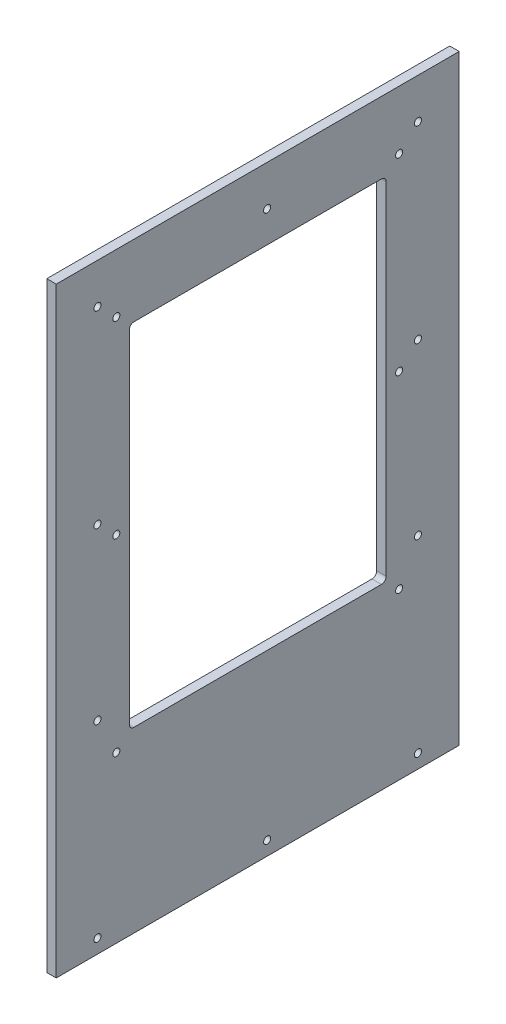
ISO-10303-21;
HEADER;
FILE_DESCRIPTION(('STEP AP214'),'2;1');
FILE_NAME('part.step','',(''),(''),'','','');
FILE_SCHEMA(('AUTOMOTIVE_DESIGN { 1 0 10303 214 1 1 1 1 }'));
ENDSEC;
DATA;
#1=APPLICATION_CONTEXT('core data for automotive mechanical design processes');
#2=APPLICATION_PROTOCOL_DEFINITION('international standard','automotive_design',2000,#1);
#3=PRODUCT_CONTEXT('',#1,'mechanical');
#4=PRODUCT('Part','Part','',(#3));
#5=PRODUCT_RELATED_PRODUCT_CATEGORY('part','',(#4));
#6=PRODUCT_DEFINITION_FORMATION('','',#4);
#7=PRODUCT_DEFINITION_CONTEXT('part definition',#1,'design');
#8=PRODUCT_DEFINITION('design','',#6,#7);
#9=PRODUCT_DEFINITION_SHAPE('','',#8);
#10=(LENGTH_UNIT() NAMED_UNIT(*) SI_UNIT(.MILLI.,.METRE.));
#11=(NAMED_UNIT(*) PLANE_ANGLE_UNIT() SI_UNIT($,.RADIAN.));
#12=(NAMED_UNIT(*) SI_UNIT($,.STERADIAN.) SOLID_ANGLE_UNIT());
#13=UNCERTAINTY_MEASURE_WITH_UNIT(LENGTH_MEASURE(1.E-05),#10,'distance_accuracy_value','');
#14=(GEOMETRIC_REPRESENTATION_CONTEXT(3) GLOBAL_UNCERTAINTY_ASSIGNED_CONTEXT((#13)) GLOBAL_UNIT_ASSIGNED_CONTEXT((#10,
#11,#12)) REPRESENTATION_CONTEXT('',''));
#15=CARTESIAN_POINT('',(0.,0.,0.));
#16=DIRECTION('',(0.,0.,1.));
#17=DIRECTION('',(1.,0.,0.));
#18=AXIS2_PLACEMENT_3D('',#15,#16,#17);
#19=CARTESIAN_POINT('',(12.7,-404.8125,-271.4625));
#20=DIRECTION('',(0.,0.,1.));
#21=DIRECTION('',(1.,0.,0.));
#22=AXIS2_PLACEMENT_3D('',#19,#20,#21);
#23=PLANE('',#22);
#24=DIRECTION('',(0.,1.,0.));
#25=VECTOR('',#24,1.);
#26=CARTESIAN_POINT('',(0.,-404.8125,-271.4625));
#27=LINE('',#26,#25);
#28=CARTESIAN_POINT('',(0.,-404.8125,-271.4625));
#29=VERTEX_POINT('',#28);
#30=CARTESIAN_POINT('',(0.,404.8125,-271.4625));
#31=VERTEX_POINT('',#30);
#32=EDGE_CURVE('E147',#29,#31,#27,.T.);
#33=ORIENTED_EDGE('',*,*,#32,.T.);
#34=DIRECTION('',(-1.,0.,0.));
#35=VECTOR('',#34,1.);
#36=CARTESIAN_POINT('',(12.7,404.8125,-271.4625));
#37=LINE('',#36,#35);
#38=CARTESIAN_POINT('',(12.7,404.8125,-271.4625));
#39=VERTEX_POINT('',#38);
#40=EDGE_CURVE('E128',#39,#31,#37,.T.);
#41=ORIENTED_EDGE('',*,*,#40,.F.);
#42=DIRECTION('',(0.,1.,0.));
#43=VECTOR('',#42,1.);
#44=CARTESIAN_POINT('',(12.7,-404.8125,-271.4625));
#45=LINE('',#44,#43);
#46=CARTESIAN_POINT('',(12.7,-404.8125,-271.4625));
#47=VERTEX_POINT('',#46);
#48=EDGE_CURVE('E135',#47,#39,#45,.T.);
#49=ORIENTED_EDGE('',*,*,#48,.F.);
#50=DIRECTION('',(-1.,0.,0.));
#51=VECTOR('',#50,1.);
#52=CARTESIAN_POINT('',(12.7,-404.8125,-271.4625));
#53=LINE('',#52,#51);
#54=EDGE_CURVE('E326',#47,#29,#53,.T.);
#55=ORIENTED_EDGE('',*,*,#54,.T.);
#56=EDGE_LOOP('',(#33,#41,#49,#55));
#57=FACE_BOUND('',#56,.T.);
#58=ADVANCED_FACE('F35',(#57),#23,.F.);
#59=CARTESIAN_POINT('',(12.7,404.8125,271.4625));
#60=DIRECTION('',(0.,-1.,0.));
#61=DIRECTION('',(0.,0.,-1.));
#62=AXIS2_PLACEMENT_3D('',#59,#60,#61);
#63=PLANE('',#62);
#64=DIRECTION('',(0.,0.,1.));
#65=VECTOR('',#64,1.);
#66=CARTESIAN_POINT('',(0.,404.8125,271.4625));
#67=LINE('',#66,#65);
#68=CARTESIAN_POINT('',(0.,404.8125,271.4625));
#69=VERTEX_POINT('',#68);
#70=EDGE_CURVE('E328',#31,#69,#67,.T.);
#71=ORIENTED_EDGE('',*,*,#70,.T.);
#72=DIRECTION('',(-1.,0.,0.));
#73=VECTOR('',#72,1.);
#74=CARTESIAN_POINT('',(12.7,404.8125,271.4625));
#75=LINE('',#74,#73);
#76=CARTESIAN_POINT('',(12.7,404.8125,271.4625));
#77=VERTEX_POINT('',#76);
#78=EDGE_CURVE('E131',#77,#69,#75,.T.);
#79=ORIENTED_EDGE('',*,*,#78,.F.);
#80=DIRECTION('',(0.,0.,1.));
#81=VECTOR('',#80,1.);
#82=CARTESIAN_POINT('',(12.7,404.8125,271.4625));
#83=LINE('',#82,#81);
#84=EDGE_CURVE('E124',#39,#77,#83,.T.);
#85=ORIENTED_EDGE('',*,*,#84,.F.);
#86=ORIENTED_EDGE('',*,*,#40,.T.);
#87=EDGE_LOOP('',(#71,#79,#85,#86));
#88=FACE_BOUND('',#87,.T.);
#89=ADVANCED_FACE('F126',(#88),#63,.F.);
#90=CARTESIAN_POINT('',(12.7,-404.8125,271.4625));
#91=DIRECTION('',(0.,0.,-1.));
#92=DIRECTION('',(-1.,0.,0.));
#93=AXIS2_PLACEMENT_3D('',#90,#91,#92);
#94=PLANE('',#93);
#95=DIRECTION('',(0.,-1.,0.));
#96=VECTOR('',#95,1.);
#97=CARTESIAN_POINT('',(0.,-404.8125,271.4625));
#98=LINE('',#97,#96);
#99=CARTESIAN_POINT('',(0.,-404.8125,271.4625));
#100=VERTEX_POINT('',#99);
#101=EDGE_CURVE('E330',#69,#100,#98,.T.);
#102=ORIENTED_EDGE('',*,*,#101,.T.);
#103=DIRECTION('',(-1.,0.,0.));
#104=VECTOR('',#103,1.);
#105=CARTESIAN_POINT('',(12.7,-404.8125,271.4625));
#106=LINE('',#105,#104);
#107=CARTESIAN_POINT('',(12.7,-404.8125,271.4625));
#108=VERTEX_POINT('',#107);
#109=EDGE_CURVE('E152',#108,#100,#106,.T.);
#110=ORIENTED_EDGE('',*,*,#109,.F.);
#111=DIRECTION('',(0.,-1.,0.));
#112=VECTOR('',#111,1.);
#113=CARTESIAN_POINT('',(12.7,-404.8125,271.4625));
#114=LINE('',#113,#112);
#115=EDGE_CURVE('E134',#77,#108,#114,.T.);
#116=ORIENTED_EDGE('',*,*,#115,.F.);
#117=ORIENTED_EDGE('',*,*,#78,.T.);
#118=EDGE_LOOP('',(#102,#110,#116,#117));
#119=FACE_BOUND('',#118,.T.);
#120=ADVANCED_FACE('F342',(#119),#94,.F.);
#121=CARTESIAN_POINT('',(12.7,-404.8125,271.4625));
#122=DIRECTION('',(0.,1.,0.));
#123=DIRECTION('',(0.,0.,1.));
#124=AXIS2_PLACEMENT_3D('',#121,#122,#123);
#125=PLANE('',#124);
#126=DIRECTION('',(0.,0.,-1.));
#127=VECTOR('',#126,1.);
#128=CARTESIAN_POINT('',(0.,-404.8125,271.4625));
#129=LINE('',#128,#127);
#130=EDGE_CURVE('E144',#100,#29,#129,.T.);
#131=ORIENTED_EDGE('',*,*,#130,.T.);
#132=ORIENTED_EDGE('',*,*,#54,.F.);
#133=DIRECTION('',(0.,0.,-1.));
#134=VECTOR('',#133,1.);
#135=CARTESIAN_POINT('',(12.7,-404.8125,271.4625));
#136=LINE('',#135,#134);
#137=EDGE_CURVE('E140',#108,#47,#136,.T.);
#138=ORIENTED_EDGE('',*,*,#137,.F.);
#139=ORIENTED_EDGE('',*,*,#109,.T.);
#140=EDGE_LOOP('',(#131,#132,#138,#139));
#141=FACE_BOUND('',#140,.T.);
#142=ADVANCED_FACE('F337',(#141),#125,.F.);
#143=CARTESIAN_POINT('',(12.7,0.,0.));
#144=DIRECTION('',(-1.,0.,0.));
#145=DIRECTION('',(0.,0.,1.));
#146=AXIS2_PLACEMENT_3D('',#143,#144,#145);
#147=PLANE('',#146);
#148=DIRECTION('',(0.,1.,0.));
#149=VECTOR('',#148,1.);
#150=CARTESIAN_POINT('',(12.7,308.45125,-173.0375));
#151=LINE('',#150,#149);
#152=CARTESIAN_POINT('',(12.7,-158.27375,-173.0375));
#153=VERTEX_POINT('',#152);
#154=CARTESIAN_POINT('',(12.7,302.10125,-173.0375));
#155=VERTEX_POINT('',#154);
#156=EDGE_CURVE('E190',#153,#155,#151,.T.);
#157=ORIENTED_EDGE('',*,*,#156,.F.);
#158=CARTESIAN_POINT('',(12.7,-158.27375,-166.6875));
#159=DIRECTION('',(-1.,0.,0.));
#160=DIRECTION('',(0.,0.,1.));
#161=AXIS2_PLACEMENT_3D('',#158,#159,#160);
#162=CIRCLE('',#161,6.35);
#163=CARTESIAN_POINT('',(12.7,-164.62375,-166.6875));
#164=VERTEX_POINT('',#163);
#165=EDGE_CURVE('E376',#153,#164,#162,.T.);
#166=ORIENTED_EDGE('',*,*,#165,.T.);
#167=DIRECTION('',(0.,0.,-1.));
#168=VECTOR('',#167,1.);
#169=CARTESIAN_POINT('',(12.7,-164.62375,173.0375));
#170=LINE('',#169,#168);
#171=CARTESIAN_POINT('',(12.7,-164.62375,166.6875));
#172=VERTEX_POINT('',#171);
#173=EDGE_CURVE('E386',#172,#164,#170,.T.);
#174=ORIENTED_EDGE('',*,*,#173,.F.);
#175=CARTESIAN_POINT('',(12.7,-158.27375,166.6875));
#176=DIRECTION('',(-1.,0.,0.));
#177=DIRECTION('',(0.,0.,1.));
#178=AXIS2_PLACEMENT_3D('',#175,#176,#177);
#179=CIRCLE('',#178,6.35);
#180=CARTESIAN_POINT('',(12.7,-158.27375,173.0375));
#181=VERTEX_POINT('',#180);
#182=EDGE_CURVE('E43',#172,#181,#179,.T.);
#183=ORIENTED_EDGE('',*,*,#182,.T.);
#184=DIRECTION('',(0.,-1.,0.));
#185=VECTOR('',#184,1.);
#186=CARTESIAN_POINT('',(12.7,308.45125,173.0375));
#187=LINE('',#186,#185);
#188=CARTESIAN_POINT('',(12.7,302.10125,173.0375));
#189=VERTEX_POINT('',#188);
#190=EDGE_CURVE('E189',#189,#181,#187,.T.);
#191=ORIENTED_EDGE('',*,*,#190,.F.);
#192=CARTESIAN_POINT('',(12.7,302.10125,166.6875));
#193=DIRECTION('',(-1.,0.,0.));
#194=DIRECTION('',(0.,0.,1.));
#195=AXIS2_PLACEMENT_3D('',#192,#193,#194);
#196=CIRCLE('',#195,6.35);
#197=CARTESIAN_POINT('',(12.7,308.45125,166.6875));
#198=VERTEX_POINT('',#197);
#199=EDGE_CURVE('E172',#189,#198,#196,.T.);
#200=ORIENTED_EDGE('',*,*,#199,.T.);
#201=DIRECTION('',(0.,0.,1.));
#202=VECTOR('',#201,1.);
#203=CARTESIAN_POINT('',(12.7,308.45125,173.0375));
#204=LINE('',#203,#202);
#205=CARTESIAN_POINT('',(12.7,308.45125,-166.6875));
#206=VERTEX_POINT('',#205);
#207=EDGE_CURVE('E185',#206,#198,#204,.T.);
#208=ORIENTED_EDGE('',*,*,#207,.F.);
#209=CARTESIAN_POINT('',(12.7,302.10125,-166.6875));
#210=DIRECTION('',(-1.,0.,0.));
#211=DIRECTION('',(0.,0.,1.));
#212=AXIS2_PLACEMENT_3D('',#209,#210,#211);
#213=CIRCLE('',#212,6.35);
#214=EDGE_CURVE('E418',#206,#155,#213,.T.);
#215=ORIENTED_EDGE('',*,*,#214,.T.);
#216=EDGE_LOOP('',(#157,#166,#174,#183,#191,#200,#208,#215));
#217=FACE_BOUND('',#216,.T.);
#218=CARTESIAN_POINT('',(12.7,71.9137500000002,190.5));
#219=DIRECTION('',(-1.,0.,0.));
#220=DIRECTION('',(0.,0.,1.));
#221=AXIS2_PLACEMENT_3D('',#218,#219,#220);
#222=CIRCLE('',#221,4.76250000000001);
#223=CARTESIAN_POINT('',(12.7,71.9137500000002,195.2625));
#224=VERTEX_POINT('',#223);
#225=EDGE_CURVE('E197',#224,#224,#222,.T.);
#226=ORIENTED_EDGE('',*,*,#225,.T.);
#227=EDGE_LOOP('',(#226));
#228=FACE_BOUND('',#227,.T.);
#229=CARTESIAN_POINT('',(12.7,71.9137500000002,-190.5));
#230=DIRECTION('',(-1.,0.,0.));
#231=DIRECTION('',(0.,0.,1.));
#232=AXIS2_PLACEMENT_3D('',#229,#230,#231);
#233=CIRCLE('',#232,4.76250000000001);
#234=CARTESIAN_POINT('',(12.7,71.9137500000002,-185.7375));
#235=VERTEX_POINT('',#234);
#236=EDGE_CURVE('E208',#235,#235,#233,.T.);
#237=ORIENTED_EDGE('',*,*,#236,.T.);
#238=EDGE_LOOP('',(#237));
#239=FACE_BOUND('',#238,.T.);
#240=CARTESIAN_POINT('',(12.7,-182.08625,190.5));
#241=DIRECTION('',(-1.,0.,0.));
#242=DIRECTION('',(0.,0.,1.));
#243=AXIS2_PLACEMENT_3D('',#240,#241,#242);
#244=CIRCLE('',#243,4.76250000000001);
#245=CARTESIAN_POINT('',(12.7,-182.08625,195.2625));
#246=VERTEX_POINT('',#245);
#247=EDGE_CURVE('E214',#246,#246,#244,.T.);
#248=ORIENTED_EDGE('',*,*,#247,.T.);
#249=EDGE_LOOP('',(#248));
#250=FACE_BOUND('',#249,.T.);
#251=CARTESIAN_POINT('',(12.7,-182.08625,-190.5));
#252=DIRECTION('',(-1.,0.,0.));
#253=DIRECTION('',(0.,0.,1.));
#254=AXIS2_PLACEMENT_3D('',#251,#252,#253);
#255=CIRCLE('',#254,4.76250000000001);
#256=CARTESIAN_POINT('',(12.7,-182.08625,-185.7375));
#257=VERTEX_POINT('',#256);
#258=EDGE_CURVE('E221',#257,#257,#255,.T.);
#259=ORIENTED_EDGE('',*,*,#258,.T.);
#260=EDGE_LOOP('',(#259));
#261=FACE_BOUND('',#260,.T.);
#262=CARTESIAN_POINT('',(12.7,325.91375,190.5));
#263=DIRECTION('',(-1.,0.,0.));
#264=DIRECTION('',(0.,0.,1.));
#265=AXIS2_PLACEMENT_3D('',#262,#263,#264);
#266=CIRCLE('',#265,4.76250000000001);
#267=CARTESIAN_POINT('',(12.7,325.91375,195.2625));
#268=VERTEX_POINT('',#267);
#269=EDGE_CURVE('E231',#268,#268,#266,.T.);
#270=ORIENTED_EDGE('',*,*,#269,.T.);
#271=EDGE_LOOP('',(#270));
#272=FACE_BOUND('',#271,.T.);
#273=CARTESIAN_POINT('',(12.7,325.91375,-190.5));
#274=DIRECTION('',(-1.,0.,0.));
#275=DIRECTION('',(0.,0.,1.));
#276=AXIS2_PLACEMENT_3D('',#273,#274,#275);
#277=CIRCLE('',#276,4.76250000000001);
#278=CARTESIAN_POINT('',(12.7,325.91375,-185.7375));
#279=VERTEX_POINT('',#278);
#280=EDGE_CURVE('E237',#279,#279,#277,.T.);
#281=ORIENTED_EDGE('',*,*,#280,.T.);
#282=EDGE_LOOP('',(#281));
#283=FACE_BOUND('',#282,.T.);
#284=CARTESIAN_POINT('',(12.7,96.5200000000002,-215.9));
#285=DIRECTION('',(1.,0.,0.));
#286=DIRECTION('',(0.,0.,1.));
#287=AXIS2_PLACEMENT_3D('',#284,#285,#286);
#288=CIRCLE('',#287,4.76250000000001);
#289=CARTESIAN_POINT('',(12.7,96.5200000000002,-211.1375));
#290=VERTEX_POINT('',#289);
#291=EDGE_CURVE('E241',#290,#290,#288,.T.);
#292=ORIENTED_EDGE('',*,*,#291,.F.);
#293=EDGE_LOOP('',(#292));
#294=FACE_BOUND('',#293,.T.);
#295=CARTESIAN_POINT('',(12.7,-132.08,-215.9));
#296=DIRECTION('',(1.,0.,0.));
#297=DIRECTION('',(0.,0.,1.));
#298=AXIS2_PLACEMENT_3D('',#295,#296,#297);
#299=CIRCLE('',#298,4.76250000000001);
#300=CARTESIAN_POINT('',(12.7,-132.08,-211.1375));
#301=VERTEX_POINT('',#300);
#302=EDGE_CURVE('E247',#301,#301,#299,.T.);
#303=ORIENTED_EDGE('',*,*,#302,.F.);
#304=EDGE_LOOP('',(#303));
#305=FACE_BOUND('',#304,.T.);
#306=CARTESIAN_POINT('',(12.7,-386.08,-12.6999999999999));
#307=DIRECTION('',(1.,0.,0.));
#308=DIRECTION('',(0.,0.,-1.));
#309=AXIS2_PLACEMENT_3D('',#306,#307,#308);
#310=CIRCLE('',#309,4.7625);
#311=CARTESIAN_POINT('',(12.7,-386.08,-17.4624999999999));
#312=VERTEX_POINT('',#311);
#313=EDGE_CURVE('E263',#312,#312,#310,.T.);
#314=ORIENTED_EDGE('',*,*,#313,.F.);
#315=EDGE_LOOP('',(#314));
#316=FACE_BOUND('',#315,.T.);
#317=CARTESIAN_POINT('',(12.7,350.52,-12.6999999999998));
#318=DIRECTION('',(1.,0.,0.));
#319=DIRECTION('',(0.,0.,-1.));
#320=AXIS2_PLACEMENT_3D('',#317,#318,#319);
#321=CIRCLE('',#320,4.7625);
#322=CARTESIAN_POINT('',(12.7,350.52,-17.4624999999998));
#323=VERTEX_POINT('',#322);
#324=EDGE_CURVE('E262',#323,#323,#321,.T.);
#325=ORIENTED_EDGE('',*,*,#324,.F.);
#326=EDGE_LOOP('',(#325));
#327=FACE_BOUND('',#326,.T.);
#328=CARTESIAN_POINT('',(12.7,-132.08,215.9));
#329=DIRECTION('',(1.,0.,0.));
#330=DIRECTION('',(0.,0.,-1.));
#331=AXIS2_PLACEMENT_3D('',#328,#329,#330);
#332=CIRCLE('',#331,4.76250000000001);
#333=CARTESIAN_POINT('',(12.7,-132.08,211.1375));
#334=VERTEX_POINT('',#333);
#335=EDGE_CURVE('E270',#334,#334,#332,.T.);
#336=ORIENTED_EDGE('',*,*,#335,.F.);
#337=EDGE_LOOP('',(#336));
#338=FACE_BOUND('',#337,.T.);
#339=CARTESIAN_POINT('',(12.7,96.5200000000002,215.9));
#340=DIRECTION('',(1.,0.,0.));
#341=DIRECTION('',(0.,0.,-1.));
#342=AXIS2_PLACEMENT_3D('',#339,#340,#341);
#343=CIRCLE('',#342,4.76250000000001);
#344=CARTESIAN_POINT('',(12.7,96.5200000000002,211.1375));
#345=VERTEX_POINT('',#344);
#346=EDGE_CURVE('E286',#345,#345,#343,.T.);
#347=ORIENTED_EDGE('',*,*,#346,.F.);
#348=EDGE_LOOP('',(#347));
#349=FACE_BOUND('',#348,.T.);
#350=CARTESIAN_POINT('',(12.7,-386.08,-215.9));
#351=DIRECTION('',(1.,0.,0.));
#352=DIRECTION('',(0.,0.,-1.));
#353=AXIS2_PLACEMENT_3D('',#350,#351,#352);
#354=CIRCLE('',#353,4.76250000000001);
#355=CARTESIAN_POINT('',(12.7,-386.08,-220.6625));
#356=VERTEX_POINT('',#355);
#357=EDGE_CURVE('E285',#356,#356,#354,.T.);
#358=ORIENTED_EDGE('',*,*,#357,.F.);
#359=EDGE_LOOP('',(#358));
#360=FACE_BOUND('',#359,.T.);
#361=CARTESIAN_POINT('',(12.7,-386.08,215.9));
#362=DIRECTION('',(1.,0.,0.));
#363=DIRECTION('',(0.,0.,-1.));
#364=AXIS2_PLACEMENT_3D('',#361,#362,#363);
#365=CIRCLE('',#364,4.76250000000001);
#366=CARTESIAN_POINT('',(12.7,-386.08,211.1375));
#367=VERTEX_POINT('',#366);
#368=EDGE_CURVE('E293',#367,#367,#365,.T.);
#369=ORIENTED_EDGE('',*,*,#368,.F.);
#370=EDGE_LOOP('',(#369));
#371=FACE_BOUND('',#370,.T.);
#372=CARTESIAN_POINT('',(12.7,350.52,-215.9));
#373=DIRECTION('',(1.,0.,0.));
#374=DIRECTION('',(0.,0.,-1.));
#375=AXIS2_PLACEMENT_3D('',#372,#373,#374);
#376=CIRCLE('',#375,4.76250000000004);
#377=CARTESIAN_POINT('',(12.7,350.52,-220.6625));
#378=VERTEX_POINT('',#377);
#379=EDGE_CURVE('E309',#378,#378,#376,.T.);
#380=ORIENTED_EDGE('',*,*,#379,.F.);
#381=EDGE_LOOP('',(#380));
#382=FACE_BOUND('',#381,.T.);
#383=CARTESIAN_POINT('',(12.7,350.52,215.9));
#384=DIRECTION('',(1.,0.,0.));
#385=DIRECTION('',(0.,0.,-1.));
#386=AXIS2_PLACEMENT_3D('',#383,#384,#385);
#387=CIRCLE('',#386,4.76250000000004);
#388=CARTESIAN_POINT('',(12.7,350.52,211.1375));
#389=VERTEX_POINT('',#388);
#390=EDGE_CURVE('E308',#389,#389,#387,.T.);
#391=ORIENTED_EDGE('',*,*,#390,.F.);
#392=EDGE_LOOP('',(#391));
#393=FACE_BOUND('',#392,.T.);
#394=ORIENTED_EDGE('',*,*,#48,.T.);
#395=ORIENTED_EDGE('',*,*,#84,.T.);
#396=ORIENTED_EDGE('',*,*,#115,.T.);
#397=ORIENTED_EDGE('',*,*,#137,.T.);
#398=EDGE_LOOP('',(#394,#395,#396,#397));
#399=FACE_BOUND('',#398,.T.);
#400=ADVANCED_FACE('F138',(#217,#228,#239,#250,#261,#272,#283,#294,#305,#316,#327,#338,#349,
#360,#371,#382,#393,#399),#147,.F.);
#401=CARTESIAN_POINT('',(0.,0.,0.));
#402=DIRECTION('',(-1.,0.,0.));
#403=DIRECTION('',(0.,0.,1.));
#404=AXIS2_PLACEMENT_3D('',#401,#402,#403);
#405=PLANE('',#404);
#406=DIRECTION('',(0.,-1.,0.));
#407=VECTOR('',#406,1.);
#408=CARTESIAN_POINT('',(0.,308.45125,173.0375));
#409=LINE('',#408,#407);
#410=CARTESIAN_POINT('',(0.,302.10125,173.0375));
#411=VERTEX_POINT('',#410);
#412=CARTESIAN_POINT('',(0.,-158.27375,173.0375));
#413=VERTEX_POINT('',#412);
#414=EDGE_CURVE('E389',#411,#413,#409,.T.);
#415=ORIENTED_EDGE('',*,*,#414,.T.);
#416=CARTESIAN_POINT('',(0.,-158.27375,166.6875));
#417=DIRECTION('',(-1.,0.,0.));
#418=DIRECTION('',(0.,0.,1.));
#419=AXIS2_PLACEMENT_3D('',#416,#417,#418);
#420=CIRCLE('',#419,6.35);
#421=CARTESIAN_POINT('',(0.,-164.62375,166.6875));
#422=VERTEX_POINT('',#421);
#423=EDGE_CURVE('E12',#413,#422,#420,.F.);
#424=ORIENTED_EDGE('',*,*,#423,.T.);
#425=DIRECTION('',(0.,0.,-1.));
#426=VECTOR('',#425,1.);
#427=CARTESIAN_POINT('',(0.,-164.62375,173.0375));
#428=LINE('',#427,#426);
#429=CARTESIAN_POINT('',(0.,-164.62375,-166.6875));
#430=VERTEX_POINT('',#429);
#431=EDGE_CURVE('E196',#422,#430,#428,.T.);
#432=ORIENTED_EDGE('',*,*,#431,.T.);
#433=CARTESIAN_POINT('',(0.,-158.27375,-166.6875));
#434=DIRECTION('',(-1.,0.,0.));
#435=DIRECTION('',(0.,0.,1.));
#436=AXIS2_PLACEMENT_3D('',#433,#434,#435);
#437=CIRCLE('',#436,6.35);
#438=CARTESIAN_POINT('',(0.,-158.27375,-173.0375));
#439=VERTEX_POINT('',#438);
#440=EDGE_CURVE('E373',#430,#439,#437,.F.);
#441=ORIENTED_EDGE('',*,*,#440,.T.);
#442=DIRECTION('',(0.,1.,0.));
#443=VECTOR('',#442,1.);
#444=CARTESIAN_POINT('',(0.,308.45125,-173.0375));
#445=LINE('',#444,#443);
#446=CARTESIAN_POINT('',(0.,302.10125,-173.0375));
#447=VERTEX_POINT('',#446);
#448=EDGE_CURVE('E394',#439,#447,#445,.T.);
#449=ORIENTED_EDGE('',*,*,#448,.T.);
#450=CARTESIAN_POINT('',(0.,302.10125,-166.6875));
#451=DIRECTION('',(-1.,0.,0.));
#452=DIRECTION('',(0.,0.,1.));
#453=AXIS2_PLACEMENT_3D('',#450,#451,#452);
#454=CIRCLE('',#453,6.35);
#455=CARTESIAN_POINT('',(0.,308.45125,-166.6875));
#456=VERTEX_POINT('',#455);
#457=EDGE_CURVE('E378',#447,#456,#454,.F.);
#458=ORIENTED_EDGE('',*,*,#457,.T.);
#459=DIRECTION('',(0.,0.,1.));
#460=VECTOR('',#459,1.);
#461=CARTESIAN_POINT('',(0.,308.45125,173.0375));
#462=LINE('',#461,#460);
#463=CARTESIAN_POINT('',(0.,308.45125,166.6875));
#464=VERTEX_POINT('',#463);
#465=EDGE_CURVE('E391',#456,#464,#462,.T.);
#466=ORIENTED_EDGE('',*,*,#465,.T.);
#467=CARTESIAN_POINT('',(0.,302.10125,166.6875));
#468=DIRECTION('',(-1.,0.,0.));
#469=DIRECTION('',(0.,0.,1.));
#470=AXIS2_PLACEMENT_3D('',#467,#468,#469);
#471=CIRCLE('',#470,6.35);
#472=EDGE_CURVE('E175',#464,#411,#471,.F.);
#473=ORIENTED_EDGE('',*,*,#472,.T.);
#474=EDGE_LOOP('',(#415,#424,#432,#441,#449,#458,#466,#473));
#475=FACE_BOUND('',#474,.T.);
#476=CARTESIAN_POINT('',(0.,71.9137500000002,190.5));
#477=DIRECTION('',(-1.,0.,0.));
#478=DIRECTION('',(0.,0.,1.));
#479=AXIS2_PLACEMENT_3D('',#476,#477,#478);
#480=CIRCLE('',#479,4.76250000000001);
#481=CARTESIAN_POINT('',(0.,71.9137500000002,195.2625));
#482=VERTEX_POINT('',#481);
#483=EDGE_CURVE('E202',#482,#482,#480,.T.);
#484=ORIENTED_EDGE('',*,*,#483,.F.);
#485=EDGE_LOOP('',(#484));
#486=FACE_BOUND('',#485,.T.);
#487=CARTESIAN_POINT('',(0.,71.9137500000002,-190.5));
#488=DIRECTION('',(-1.,0.,0.));
#489=DIRECTION('',(0.,0.,1.));
#490=AXIS2_PLACEMENT_3D('',#487,#488,#489);
#491=CIRCLE('',#490,4.76250000000001);
#492=CARTESIAN_POINT('',(0.,71.9137500000002,-185.7375));
#493=VERTEX_POINT('',#492);
#494=EDGE_CURVE('E201',#493,#493,#491,.T.);
#495=ORIENTED_EDGE('',*,*,#494,.F.);
#496=EDGE_LOOP('',(#495));
#497=FACE_BOUND('',#496,.T.);
#498=CARTESIAN_POINT('',(0.,-182.08625,190.5));
#499=DIRECTION('',(-1.,0.,0.));
#500=DIRECTION('',(0.,0.,1.));
#501=AXIS2_PLACEMENT_3D('',#498,#499,#500);
#502=CIRCLE('',#501,4.76250000000001);
#503=CARTESIAN_POINT('',(0.,-182.08625,195.2625));
#504=VERTEX_POINT('',#503);
#505=EDGE_CURVE('E212',#504,#504,#502,.T.);
#506=ORIENTED_EDGE('',*,*,#505,.F.);
#507=EDGE_LOOP('',(#506));
#508=FACE_BOUND('',#507,.T.);
#509=CARTESIAN_POINT('',(0.,-182.08625,-190.5));
#510=DIRECTION('',(-1.,0.,0.));
#511=DIRECTION('',(0.,0.,1.));
#512=AXIS2_PLACEMENT_3D('',#509,#510,#511);
#513=CIRCLE('',#512,4.76250000000001);
#514=CARTESIAN_POINT('',(0.,-182.08625,-185.7375));
#515=VERTEX_POINT('',#514);
#516=EDGE_CURVE('E218',#515,#515,#513,.T.);
#517=ORIENTED_EDGE('',*,*,#516,.F.);
#518=EDGE_LOOP('',(#517));
#519=FACE_BOUND('',#518,.T.);
#520=CARTESIAN_POINT('',(0.,325.91375,190.5));
#521=DIRECTION('',(-1.,0.,0.));
#522=DIRECTION('',(0.,0.,1.));
#523=AXIS2_PLACEMENT_3D('',#520,#521,#522);
#524=CIRCLE('',#523,4.76250000000001);
#525=CARTESIAN_POINT('',(0.,325.91375,195.2625));
#526=VERTEX_POINT('',#525);
#527=EDGE_CURVE('E225',#526,#526,#524,.T.);
#528=ORIENTED_EDGE('',*,*,#527,.F.);
#529=EDGE_LOOP('',(#528));
#530=FACE_BOUND('',#529,.T.);
#531=CARTESIAN_POINT('',(0.,325.91375,-190.5));
#532=DIRECTION('',(-1.,0.,0.));
#533=DIRECTION('',(0.,0.,1.));
#534=AXIS2_PLACEMENT_3D('',#531,#532,#533);
#535=CIRCLE('',#534,4.76250000000001);
#536=CARTESIAN_POINT('',(0.,325.91375,-185.7375));
#537=VERTEX_POINT('',#536);
#538=EDGE_CURVE('E235',#537,#537,#535,.T.);
#539=ORIENTED_EDGE('',*,*,#538,.F.);
#540=EDGE_LOOP('',(#539));
#541=FACE_BOUND('',#540,.T.);
#542=CARTESIAN_POINT('',(0.,96.5200000000002,-215.9));
#543=DIRECTION('',(1.,0.,0.));
#544=DIRECTION('',(0.,0.,1.));
#545=AXIS2_PLACEMENT_3D('',#542,#543,#544);
#546=CIRCLE('',#545,4.76250000000001);
#547=CARTESIAN_POINT('',(0.,96.5200000000002,-211.1375));
#548=VERTEX_POINT('',#547);
#549=EDGE_CURVE('E244',#548,#548,#546,.T.);
#550=ORIENTED_EDGE('',*,*,#549,.T.);
#551=EDGE_LOOP('',(#550));
#552=FACE_BOUND('',#551,.T.);
#553=CARTESIAN_POINT('',(0.,-132.08,-215.9));
#554=DIRECTION('',(1.,0.,0.));
#555=DIRECTION('',(0.,0.,1.));
#556=AXIS2_PLACEMENT_3D('',#553,#554,#555);
#557=CIRCLE('',#556,4.76250000000001);
#558=CARTESIAN_POINT('',(0.,-132.08,-211.1375));
#559=VERTEX_POINT('',#558);
#560=EDGE_CURVE('E251',#559,#559,#557,.T.);
#561=ORIENTED_EDGE('',*,*,#560,.T.);
#562=EDGE_LOOP('',(#561));
#563=FACE_BOUND('',#562,.T.);
#564=CARTESIAN_POINT('',(0.,-386.08,-12.6999999999999));
#565=DIRECTION('',(1.,0.,0.));
#566=DIRECTION('',(0.,0.,-1.));
#567=AXIS2_PLACEMENT_3D('',#564,#565,#566);
#568=CIRCLE('',#567,4.7625);
#569=CARTESIAN_POINT('',(0.,-386.08,-17.4624999999999));
#570=VERTEX_POINT('',#569);
#571=EDGE_CURVE('E260',#570,#570,#568,.T.);
#572=ORIENTED_EDGE('',*,*,#571,.T.);
#573=EDGE_LOOP('',(#572));
#574=FACE_BOUND('',#573,.T.);
#575=CARTESIAN_POINT('',(0.,350.52,-12.6999999999998));
#576=DIRECTION('',(1.,0.,0.));
#577=DIRECTION('',(0.,0.,-1.));
#578=AXIS2_PLACEMENT_3D('',#575,#576,#577);
#579=CIRCLE('',#578,4.7625);
#580=CARTESIAN_POINT('',(0.,350.52,-17.4624999999998));
#581=VERTEX_POINT('',#580);
#582=EDGE_CURVE('E267',#581,#581,#579,.T.);
#583=ORIENTED_EDGE('',*,*,#582,.T.);
#584=EDGE_LOOP('',(#583));
#585=FACE_BOUND('',#584,.T.);
#586=CARTESIAN_POINT('',(0.,-132.08,215.9));
#587=DIRECTION('',(1.,0.,0.));
#588=DIRECTION('',(0.,0.,-1.));
#589=AXIS2_PLACEMENT_3D('',#586,#587,#588);
#590=CIRCLE('',#589,4.76250000000001);
#591=CARTESIAN_POINT('',(0.,-132.08,211.1375));
#592=VERTEX_POINT('',#591);
#593=EDGE_CURVE('E274',#592,#592,#590,.T.);
#594=ORIENTED_EDGE('',*,*,#593,.T.);
#595=EDGE_LOOP('',(#594));
#596=FACE_BOUND('',#595,.T.);
#597=CARTESIAN_POINT('',(0.,96.5200000000002,215.9));
#598=DIRECTION('',(1.,0.,0.));
#599=DIRECTION('',(0.,0.,-1.));
#600=AXIS2_PLACEMENT_3D('',#597,#598,#599);
#601=CIRCLE('',#600,4.76250000000001);
#602=CARTESIAN_POINT('',(0.,96.5200000000002,211.1375));
#603=VERTEX_POINT('',#602);
#604=EDGE_CURVE('E283',#603,#603,#601,.T.);
#605=ORIENTED_EDGE('',*,*,#604,.T.);
#606=EDGE_LOOP('',(#605));
#607=FACE_BOUND('',#606,.T.);
#608=CARTESIAN_POINT('',(0.,-386.08,-215.9));
#609=DIRECTION('',(1.,0.,0.));
#610=DIRECTION('',(0.,0.,-1.));
#611=AXIS2_PLACEMENT_3D('',#608,#609,#610);
#612=CIRCLE('',#611,4.76250000000001);
#613=CARTESIAN_POINT('',(0.,-386.08,-220.6625));
#614=VERTEX_POINT('',#613);
#615=EDGE_CURVE('E290',#614,#614,#612,.T.);
#616=ORIENTED_EDGE('',*,*,#615,.T.);
#617=EDGE_LOOP('',(#616));
#618=FACE_BOUND('',#617,.T.);
#619=CARTESIAN_POINT('',(0.,-386.08,215.9));
#620=DIRECTION('',(1.,0.,0.));
#621=DIRECTION('',(0.,0.,-1.));
#622=AXIS2_PLACEMENT_3D('',#619,#620,#621);
#623=CIRCLE('',#622,4.76250000000001);
#624=CARTESIAN_POINT('',(0.,-386.08,211.1375));
#625=VERTEX_POINT('',#624);
#626=EDGE_CURVE('E297',#625,#625,#623,.T.);
#627=ORIENTED_EDGE('',*,*,#626,.T.);
#628=EDGE_LOOP('',(#627));
#629=FACE_BOUND('',#628,.T.);
#630=CARTESIAN_POINT('',(0.,350.52,-215.9));
#631=DIRECTION('',(1.,0.,0.));
#632=DIRECTION('',(0.,0.,-1.));
#633=AXIS2_PLACEMENT_3D('',#630,#631,#632);
#634=CIRCLE('',#633,4.76250000000004);
#635=CARTESIAN_POINT('',(0.,350.52,-220.6625));
#636=VERTEX_POINT('',#635);
#637=EDGE_CURVE('E306',#636,#636,#634,.T.);
#638=ORIENTED_EDGE('',*,*,#637,.T.);
#639=EDGE_LOOP('',(#638));
#640=FACE_BOUND('',#639,.T.);
#641=CARTESIAN_POINT('',(0.,350.52,215.9));
#642=DIRECTION('',(1.,0.,0.));
#643=DIRECTION('',(0.,0.,-1.));
#644=AXIS2_PLACEMENT_3D('',#641,#642,#643);
#645=CIRCLE('',#644,4.76250000000004);
#646=CARTESIAN_POINT('',(0.,350.52,211.1375));
#647=VERTEX_POINT('',#646);
#648=EDGE_CURVE('E313',#647,#647,#645,.T.);
#649=ORIENTED_EDGE('',*,*,#648,.T.);
#650=EDGE_LOOP('',(#649));
#651=FACE_BOUND('',#650,.T.);
#652=ORIENTED_EDGE('',*,*,#32,.F.);
#653=ORIENTED_EDGE('',*,*,#130,.F.);
#654=ORIENTED_EDGE('',*,*,#101,.F.);
#655=ORIENTED_EDGE('',*,*,#70,.F.);
#656=EDGE_LOOP('',(#652,#653,#654,#655));
#657=FACE_BOUND('',#656,.T.);
#658=ADVANCED_FACE('F341',(#475,#486,#497,#508,#519,#530,#541,#552,#563,#574,#585,#596,#607,
#618,#629,#640,#651,#657),#405,.T.);
#659=CARTESIAN_POINT('',(0.,350.52,215.9));
#660=DIRECTION('',(1.,0.,0.));
#661=DIRECTION('',(0.,0.,-1.));
#662=AXIS2_PLACEMENT_3D('',#659,#660,#661);
#663=CYLINDRICAL_SURFACE('',#662,4.76250000000004);
#664=ORIENTED_EDGE('',*,*,#648,.F.);
#665=EDGE_LOOP('',(#664));
#666=FACE_BOUND('',#665,.T.);
#667=ORIENTED_EDGE('',*,*,#390,.T.);
#668=EDGE_LOOP('',(#667));
#669=FACE_BOUND('',#668,.T.);
#670=ADVANCED_FACE('F491',(#666,#669),#663,.F.);
#671=CARTESIAN_POINT('',(0.,350.52,-215.9));
#672=DIRECTION('',(1.,0.,0.));
#673=DIRECTION('',(0.,0.,-1.));
#674=AXIS2_PLACEMENT_3D('',#671,#672,#673);
#675=CYLINDRICAL_SURFACE('',#674,4.76250000000004);
#676=ORIENTED_EDGE('',*,*,#637,.F.);
#677=EDGE_LOOP('',(#676));
#678=FACE_BOUND('',#677,.T.);
#679=ORIENTED_EDGE('',*,*,#379,.T.);
#680=EDGE_LOOP('',(#679));
#681=FACE_BOUND('',#680,.T.);
#682=ADVANCED_FACE('F487',(#678,#681),#675,.F.);
#683=CARTESIAN_POINT('',(0.,-386.08,215.9));
#684=DIRECTION('',(1.,0.,0.));
#685=DIRECTION('',(0.,0.,-1.));
#686=AXIS2_PLACEMENT_3D('',#683,#684,#685);
#687=CYLINDRICAL_SURFACE('',#686,4.76250000000001);
#688=ORIENTED_EDGE('',*,*,#626,.F.);
#689=EDGE_LOOP('',(#688));
#690=FACE_BOUND('',#689,.T.);
#691=ORIENTED_EDGE('',*,*,#368,.T.);
#692=EDGE_LOOP('',(#691));
#693=FACE_BOUND('',#692,.T.);
#694=ADVANCED_FACE('F483',(#690,#693),#687,.F.);
#695=CARTESIAN_POINT('',(0.,-386.08,-215.9));
#696=DIRECTION('',(1.,0.,0.));
#697=DIRECTION('',(0.,0.,-1.));
#698=AXIS2_PLACEMENT_3D('',#695,#696,#697);
#699=CYLINDRICAL_SURFACE('',#698,4.76250000000001);
#700=ORIENTED_EDGE('',*,*,#615,.F.);
#701=EDGE_LOOP('',(#700));
#702=FACE_BOUND('',#701,.T.);
#703=ORIENTED_EDGE('',*,*,#357,.T.);
#704=EDGE_LOOP('',(#703));
#705=FACE_BOUND('',#704,.T.);
#706=ADVANCED_FACE('F479',(#702,#705),#699,.F.);
#707=CARTESIAN_POINT('',(0.,96.5200000000002,215.9));
#708=DIRECTION('',(1.,0.,0.));
#709=DIRECTION('',(0.,0.,-1.));
#710=AXIS2_PLACEMENT_3D('',#707,#708,#709);
#711=CYLINDRICAL_SURFACE('',#710,4.76250000000001);
#712=ORIENTED_EDGE('',*,*,#604,.F.);
#713=EDGE_LOOP('',(#712));
#714=FACE_BOUND('',#713,.T.);
#715=ORIENTED_EDGE('',*,*,#346,.T.);
#716=EDGE_LOOP('',(#715));
#717=FACE_BOUND('',#716,.T.);
#718=ADVANCED_FACE('F475',(#714,#717),#711,.F.);
#719=CARTESIAN_POINT('',(0.,-132.08,215.9));
#720=DIRECTION('',(1.,0.,0.));
#721=DIRECTION('',(0.,0.,-1.));
#722=AXIS2_PLACEMENT_3D('',#719,#720,#721);
#723=CYLINDRICAL_SURFACE('',#722,4.76250000000001);
#724=ORIENTED_EDGE('',*,*,#593,.F.);
#725=EDGE_LOOP('',(#724));
#726=FACE_BOUND('',#725,.T.);
#727=ORIENTED_EDGE('',*,*,#335,.T.);
#728=EDGE_LOOP('',(#727));
#729=FACE_BOUND('',#728,.T.);
#730=ADVANCED_FACE('F471',(#726,#729),#723,.F.);
#731=CARTESIAN_POINT('',(0.,350.52,-12.6999999999998));
#732=DIRECTION('',(1.,0.,0.));
#733=DIRECTION('',(0.,0.,-1.));
#734=AXIS2_PLACEMENT_3D('',#731,#732,#733);
#735=CYLINDRICAL_SURFACE('',#734,4.7625);
#736=ORIENTED_EDGE('',*,*,#582,.F.);
#737=EDGE_LOOP('',(#736));
#738=FACE_BOUND('',#737,.T.);
#739=ORIENTED_EDGE('',*,*,#324,.T.);
#740=EDGE_LOOP('',(#739));
#741=FACE_BOUND('',#740,.T.);
#742=ADVANCED_FACE('F467',(#738,#741),#735,.F.);
#743=CARTESIAN_POINT('',(0.,-386.08,-12.6999999999999));
#744=DIRECTION('',(1.,0.,0.));
#745=DIRECTION('',(0.,0.,-1.));
#746=AXIS2_PLACEMENT_3D('',#743,#744,#745);
#747=CYLINDRICAL_SURFACE('',#746,4.7625);
#748=ORIENTED_EDGE('',*,*,#571,.F.);
#749=EDGE_LOOP('',(#748));
#750=FACE_BOUND('',#749,.T.);
#751=ORIENTED_EDGE('',*,*,#313,.T.);
#752=EDGE_LOOP('',(#751));
#753=FACE_BOUND('',#752,.T.);
#754=ADVANCED_FACE('F463',(#750,#753),#747,.F.);
#755=CARTESIAN_POINT('',(0.,-132.08,-215.9));
#756=DIRECTION('',(1.,0.,0.));
#757=DIRECTION('',(0.,0.,-1.));
#758=AXIS2_PLACEMENT_3D('',#755,#756,#757);
#759=CYLINDRICAL_SURFACE('',#758,4.76250000000001);
#760=ORIENTED_EDGE('',*,*,#560,.F.);
#761=EDGE_LOOP('',(#760));
#762=FACE_BOUND('',#761,.T.);
#763=ORIENTED_EDGE('',*,*,#302,.T.);
#764=EDGE_LOOP('',(#763));
#765=FACE_BOUND('',#764,.T.);
#766=ADVANCED_FACE('F459',(#762,#765),#759,.F.);
#767=CARTESIAN_POINT('',(0.,96.5200000000002,-215.9));
#768=DIRECTION('',(1.,0.,0.));
#769=DIRECTION('',(0.,0.,-1.));
#770=AXIS2_PLACEMENT_3D('',#767,#768,#769);
#771=CYLINDRICAL_SURFACE('',#770,4.76250000000001);
#772=ORIENTED_EDGE('',*,*,#549,.F.);
#773=EDGE_LOOP('',(#772));
#774=FACE_BOUND('',#773,.T.);
#775=ORIENTED_EDGE('',*,*,#291,.T.);
#776=EDGE_LOOP('',(#775));
#777=FACE_BOUND('',#776,.T.);
#778=ADVANCED_FACE('F455',(#774,#777),#771,.F.);
#779=CARTESIAN_POINT('',(12.7,325.91375,-190.5));
#780=DIRECTION('',(-1.,0.,0.));
#781=DIRECTION('',(0.,0.,1.));
#782=AXIS2_PLACEMENT_3D('',#779,#780,#781);
#783=CYLINDRICAL_SURFACE('',#782,4.76250000000001);
#784=ORIENTED_EDGE('',*,*,#280,.F.);
#785=EDGE_LOOP('',(#784));
#786=FACE_BOUND('',#785,.T.);
#787=ORIENTED_EDGE('',*,*,#538,.T.);
#788=EDGE_LOOP('',(#787));
#789=FACE_BOUND('',#788,.T.);
#790=ADVANCED_FACE('F451',(#786,#789),#783,.F.);
#791=CARTESIAN_POINT('',(12.7,325.91375,190.5));
#792=DIRECTION('',(-1.,0.,0.));
#793=DIRECTION('',(0.,0.,1.));
#794=AXIS2_PLACEMENT_3D('',#791,#792,#793);
#795=CYLINDRICAL_SURFACE('',#794,4.76250000000001);
#796=ORIENTED_EDGE('',*,*,#269,.F.);
#797=EDGE_LOOP('',(#796));
#798=FACE_BOUND('',#797,.T.);
#799=ORIENTED_EDGE('',*,*,#527,.T.);
#800=EDGE_LOOP('',(#799));
#801=FACE_BOUND('',#800,.T.);
#802=ADVANCED_FACE('F447',(#798,#801),#795,.F.);
#803=CARTESIAN_POINT('',(12.7,-182.08625,-190.5));
#804=DIRECTION('',(-1.,0.,0.));
#805=DIRECTION('',(0.,0.,1.));
#806=AXIS2_PLACEMENT_3D('',#803,#804,#805);
#807=CYLINDRICAL_SURFACE('',#806,4.76250000000001);
#808=ORIENTED_EDGE('',*,*,#258,.F.);
#809=EDGE_LOOP('',(#808));
#810=FACE_BOUND('',#809,.T.);
#811=ORIENTED_EDGE('',*,*,#516,.T.);
#812=EDGE_LOOP('',(#811));
#813=FACE_BOUND('',#812,.T.);
#814=ADVANCED_FACE('F443',(#810,#813),#807,.F.);
#815=CARTESIAN_POINT('',(12.7,-182.08625,190.5));
#816=DIRECTION('',(-1.,0.,0.));
#817=DIRECTION('',(0.,0.,1.));
#818=AXIS2_PLACEMENT_3D('',#815,#816,#817);
#819=CYLINDRICAL_SURFACE('',#818,4.76250000000001);
#820=ORIENTED_EDGE('',*,*,#247,.F.);
#821=EDGE_LOOP('',(#820));
#822=FACE_BOUND('',#821,.T.);
#823=ORIENTED_EDGE('',*,*,#505,.T.);
#824=EDGE_LOOP('',(#823));
#825=FACE_BOUND('',#824,.T.);
#826=ADVANCED_FACE('F439',(#822,#825),#819,.F.);
#827=CARTESIAN_POINT('',(12.7,71.9137500000002,-190.5));
#828=DIRECTION('',(-1.,0.,0.));
#829=DIRECTION('',(0.,0.,1.));
#830=AXIS2_PLACEMENT_3D('',#827,#828,#829);
#831=CYLINDRICAL_SURFACE('',#830,4.76250000000001);
#832=ORIENTED_EDGE('',*,*,#236,.F.);
#833=EDGE_LOOP('',(#832));
#834=FACE_BOUND('',#833,.T.);
#835=ORIENTED_EDGE('',*,*,#494,.T.);
#836=EDGE_LOOP('',(#835));
#837=FACE_BOUND('',#836,.T.);
#838=ADVANCED_FACE('F435',(#834,#837),#831,.F.);
#839=CARTESIAN_POINT('',(12.7,71.9137500000002,190.5));
#840=DIRECTION('',(-1.,0.,0.));
#841=DIRECTION('',(0.,0.,1.));
#842=AXIS2_PLACEMENT_3D('',#839,#840,#841);
#843=CYLINDRICAL_SURFACE('',#842,4.76250000000001);
#844=ORIENTED_EDGE('',*,*,#225,.F.);
#845=EDGE_LOOP('',(#844));
#846=FACE_BOUND('',#845,.T.);
#847=ORIENTED_EDGE('',*,*,#483,.T.);
#848=EDGE_LOOP('',(#847));
#849=FACE_BOUND('',#848,.T.);
#850=ADVANCED_FACE('F432',(#846,#849),#843,.F.);
#851=CARTESIAN_POINT('',(0.,-164.62375,173.0375));
#852=DIRECTION('',(0.,-1.,0.));
#853=DIRECTION('',(0.,0.,-1.));
#854=AXIS2_PLACEMENT_3D('',#851,#852,#853);
#855=PLANE('',#854);
#856=ORIENTED_EDGE('',*,*,#173,.T.);
#857=DIRECTION('',(1.,0.,0.));
#858=VECTOR('',#857,1.);
#859=CARTESIAN_POINT('',(0.,-164.62375,-166.6875));
#860=LINE('',#859,#858);
#861=EDGE_CURVE('E50',#164,#430,#860,.F.);
#862=ORIENTED_EDGE('',*,*,#861,.T.);
#863=ORIENTED_EDGE('',*,*,#431,.F.);
#864=DIRECTION('',(1.,0.,0.));
#865=VECTOR('',#864,1.);
#866=CARTESIAN_POINT('',(12.7,-164.62375,166.6875));
#867=LINE('',#866,#865);
#868=EDGE_CURVE('E168',#422,#172,#867,.T.);
#869=ORIENTED_EDGE('',*,*,#868,.T.);
#870=EDGE_LOOP('',(#856,#862,#863,#869));
#871=FACE_BOUND('',#870,.T.);
#872=ADVANCED_FACE('F398',(#871),#855,.F.);
#873=CARTESIAN_POINT('',(0.,308.45125,173.0375));
#874=DIRECTION('',(0.,0.,1.));
#875=DIRECTION('',(0.,-1.,0.));
#876=AXIS2_PLACEMENT_3D('',#873,#874,#875);
#877=PLANE('',#876);
#878=ORIENTED_EDGE('',*,*,#414,.F.);
#879=DIRECTION('',(1.,0.,0.));
#880=VECTOR('',#879,1.);
#881=CARTESIAN_POINT('',(12.7,302.10125,173.0375));
#882=LINE('',#881,#880);
#883=EDGE_CURVE('E150',#411,#189,#882,.T.);
#884=ORIENTED_EDGE('',*,*,#883,.T.);
#885=ORIENTED_EDGE('',*,*,#190,.T.);
#886=DIRECTION('',(1.,0.,0.));
#887=VECTOR('',#886,1.);
#888=CARTESIAN_POINT('',(0.,-158.27375,173.0375));
#889=LINE('',#888,#887);
#890=EDGE_CURVE('E148',#181,#413,#889,.F.);
#891=ORIENTED_EDGE('',*,*,#890,.T.);
#892=EDGE_LOOP('',(#878,#884,#885,#891));
#893=FACE_BOUND('',#892,.T.);
#894=ADVANCED_FACE('F407',(#893),#877,.F.);
#895=CARTESIAN_POINT('',(0.,308.45125,173.0375));
#896=DIRECTION('',(0.,1.,0.));
#897=DIRECTION('',(0.,0.,1.));
#898=AXIS2_PLACEMENT_3D('',#895,#896,#897);
#899=PLANE('',#898);
#900=ORIENTED_EDGE('',*,*,#207,.T.);
#901=DIRECTION('',(1.,0.,0.));
#902=VECTOR('',#901,1.);
#903=CARTESIAN_POINT('',(0.,308.45125,166.6875));
#904=LINE('',#903,#902);
#905=EDGE_CURVE('E161',#198,#464,#904,.F.);
#906=ORIENTED_EDGE('',*,*,#905,.T.);
#907=ORIENTED_EDGE('',*,*,#465,.F.);
#908=DIRECTION('',(1.,0.,0.));
#909=VECTOR('',#908,1.);
#910=CARTESIAN_POINT('',(12.7,308.45125,-166.6875));
#911=LINE('',#910,#909);
#912=EDGE_CURVE('E158',#456,#206,#911,.T.);
#913=ORIENTED_EDGE('',*,*,#912,.T.);
#914=EDGE_LOOP('',(#900,#906,#907,#913));
#915=FACE_BOUND('',#914,.T.);
#916=ADVANCED_FACE('F413',(#915),#899,.F.);
#917=CARTESIAN_POINT('',(0.,308.45125,-173.0375));
#918=DIRECTION('',(0.,0.,-1.));
#919=DIRECTION('',(0.,1.,0.));
#920=AXIS2_PLACEMENT_3D('',#917,#918,#919);
#921=PLANE('',#920);
#922=ORIENTED_EDGE('',*,*,#156,.T.);
#923=DIRECTION('',(1.,0.,0.));
#924=VECTOR('',#923,1.);
#925=CARTESIAN_POINT('',(0.,302.10125,-173.0375));
#926=LINE('',#925,#924);
#927=EDGE_CURVE('E166',#155,#447,#926,.F.);
#928=ORIENTED_EDGE('',*,*,#927,.T.);
#929=ORIENTED_EDGE('',*,*,#448,.F.);
#930=DIRECTION('',(1.,0.,0.));
#931=VECTOR('',#930,1.);
#932=CARTESIAN_POINT('',(12.7,-158.27375,-173.0375));
#933=LINE('',#932,#931);
#934=EDGE_CURVE('E163',#439,#153,#933,.T.);
#935=ORIENTED_EDGE('',*,*,#934,.T.);
#936=EDGE_LOOP('',(#922,#928,#929,#935));
#937=FACE_BOUND('',#936,.T.);
#938=ADVANCED_FACE('F360',(#937),#921,.F.);
#939=CARTESIAN_POINT('',(0.,302.10125,166.6875));
#940=DIRECTION('',(-1.,0.,0.));
#941=DIRECTION('',(0.,0.,1.));
#942=AXIS2_PLACEMENT_3D('',#939,#940,#941);
#943=CYLINDRICAL_SURFACE('',#942,6.35);
#944=ORIENTED_EDGE('',*,*,#472,.F.);
#945=ORIENTED_EDGE('',*,*,#905,.F.);
#946=ORIENTED_EDGE('',*,*,#199,.F.);
#947=ORIENTED_EDGE('',*,*,#883,.F.);
#948=EDGE_LOOP('',(#944,#945,#946,#947));
#949=FACE_BOUND('',#948,.T.);
#950=ADVANCED_FACE('F356',(#949),#943,.F.);
#951=CARTESIAN_POINT('',(0.,302.10125,-166.6875));
#952=DIRECTION('',(-1.,0.,0.));
#953=DIRECTION('',(0.,0.,1.));
#954=AXIS2_PLACEMENT_3D('',#951,#952,#953);
#955=CYLINDRICAL_SURFACE('',#954,6.35);
#956=ORIENTED_EDGE('',*,*,#457,.F.);
#957=ORIENTED_EDGE('',*,*,#927,.F.);
#958=ORIENTED_EDGE('',*,*,#214,.F.);
#959=ORIENTED_EDGE('',*,*,#912,.F.);
#960=EDGE_LOOP('',(#956,#957,#958,#959));
#961=FACE_BOUND('',#960,.T.);
#962=ADVANCED_FACE('F359',(#961),#955,.F.);
#963=CARTESIAN_POINT('',(0.,-158.27375,-166.6875));
#964=DIRECTION('',(-1.,0.,0.));
#965=DIRECTION('',(0.,0.,1.));
#966=AXIS2_PLACEMENT_3D('',#963,#964,#965);
#967=CYLINDRICAL_SURFACE('',#966,6.35);
#968=ORIENTED_EDGE('',*,*,#440,.F.);
#969=ORIENTED_EDGE('',*,*,#861,.F.);
#970=ORIENTED_EDGE('',*,*,#165,.F.);
#971=ORIENTED_EDGE('',*,*,#934,.F.);
#972=EDGE_LOOP('',(#968,#969,#970,#971));
#973=FACE_BOUND('',#972,.T.);
#974=ADVANCED_FACE('F363',(#973),#967,.F.);
#975=CARTESIAN_POINT('',(0.,-158.27375,166.6875));
#976=DIRECTION('',(-1.,0.,0.));
#977=DIRECTION('',(0.,0.,1.));
#978=AXIS2_PLACEMENT_3D('',#975,#976,#977);
#979=CYLINDRICAL_SURFACE('',#978,6.35);
#980=ORIENTED_EDGE('',*,*,#423,.F.);
#981=ORIENTED_EDGE('',*,*,#890,.F.);
#982=ORIENTED_EDGE('',*,*,#182,.F.);
#983=ORIENTED_EDGE('',*,*,#868,.F.);
#984=EDGE_LOOP('',(#980,#981,#982,#983));
#985=FACE_BOUND('',#984,.T.);
#986=ADVANCED_FACE('F37',(#985),#979,.F.);
#987=CLOSED_SHELL('',(#58,#89,#120,#142,#400,#658,#670,#682,#694,#706,#718,#730,#742,#754,#766,
#778,#790,#802,#814,#826,#838,#850,#872,#894,#916,#938,#950,#962,#974,#986));
#988=MANIFOLD_SOLID_BREP('B2',#987);
#989=ADVANCED_BREP_SHAPE_REPRESENTATION('',(#18,#988),#14);
#990=SHAPE_DEFINITION_REPRESENTATION(#9,#989);
ENDSEC;
END-ISO-10303-21;
